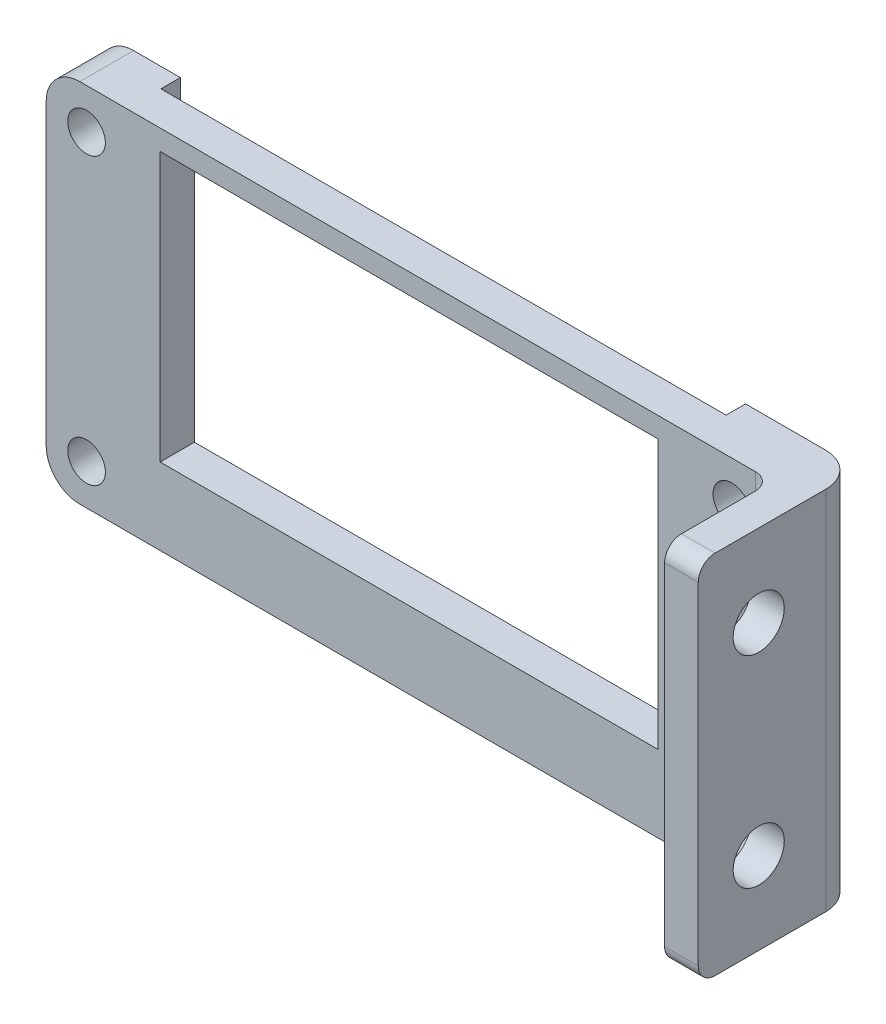
ISO-10303-21;
HEADER;
FILE_DESCRIPTION(('STEP AP214'),'2;1');
FILE_NAME('part.step','',(''),(''),'','','');
FILE_SCHEMA(('AUTOMOTIVE_DESIGN { 1 0 10303 214 1 1 1 1 }'));
ENDSEC;
DATA;
#1=APPLICATION_CONTEXT('core data for automotive mechanical design processes');
#2=APPLICATION_PROTOCOL_DEFINITION('international standard','automotive_design',2000,#1);
#3=PRODUCT_CONTEXT('',#1,'mechanical');
#4=PRODUCT('Part','Part','',(#3));
#5=PRODUCT_RELATED_PRODUCT_CATEGORY('part','',(#4));
#6=PRODUCT_DEFINITION_FORMATION('','',#4);
#7=PRODUCT_DEFINITION_CONTEXT('part definition',#1,'design');
#8=PRODUCT_DEFINITION('design','',#6,#7);
#9=PRODUCT_DEFINITION_SHAPE('','',#8);
#10=(LENGTH_UNIT() NAMED_UNIT(*) SI_UNIT(.MILLI.,.METRE.));
#11=(NAMED_UNIT(*) PLANE_ANGLE_UNIT() SI_UNIT($,.RADIAN.));
#12=(NAMED_UNIT(*) SI_UNIT($,.STERADIAN.) SOLID_ANGLE_UNIT());
#13=UNCERTAINTY_MEASURE_WITH_UNIT(LENGTH_MEASURE(1.E-05),#10,'distance_accuracy_value','');
#14=(GEOMETRIC_REPRESENTATION_CONTEXT(3) GLOBAL_UNCERTAINTY_ASSIGNED_CONTEXT((#13)) GLOBAL_UNIT_ASSIGNED_CONTEXT((#10,
#11,#12)) REPRESENTATION_CONTEXT('',''));
#15=CARTESIAN_POINT('',(0.,0.,0.));
#16=DIRECTION('',(0.,0.,1.));
#17=DIRECTION('',(1.,0.,0.));
#18=AXIS2_PLACEMENT_3D('',#15,#16,#17);
#19=CARTESIAN_POINT('',(-27.,-73.4652804702332,-1.44999999999999));
#20=DIRECTION('',(-1.,0.,0.));
#21=DIRECTION('',(0.,-1.,0.));
#22=AXIS2_PLACEMENT_3D('',#19,#20,#21);
#23=PLANE('',#22);
#24=DIRECTION('',(0.,1.,0.));
#25=VECTOR('',#24,1.);
#26=CARTESIAN_POINT('',(-27.,-73.4652804702332,2.55000000000001));
#27=LINE('',#26,#25);
#28=CARTESIAN_POINT('',(-27.,-13.205,2.55000000000001));
#29=VERTEX_POINT('',#28);
#30=CARTESIAN_POINT('',(-27.,9.01500000000001,2.55000000000001));
#31=VERTEX_POINT('',#30);
#32=EDGE_CURVE('E244',#29,#31,#27,.T.);
#33=ORIENTED_EDGE('',*,*,#32,.T.);
#34=DIRECTION('',(0.,0.,1.));
#35=VECTOR('',#34,1.);
#36=CARTESIAN_POINT('',(-27.,9.01500000000001,-1.44999999999999));
#37=LINE('',#36,#35);
#38=CARTESIAN_POINT('',(-27.,9.01500000000001,-1.44999999999999));
#39=VERTEX_POINT('',#38);
#40=EDGE_CURVE('E292',#31,#39,#37,.F.);
#41=ORIENTED_EDGE('',*,*,#40,.T.);
#42=DIRECTION('',(0.,1.,0.));
#43=VECTOR('',#42,1.);
#44=CARTESIAN_POINT('',(-27.,-73.4652804702332,-1.44999999999999));
#45=LINE('',#44,#43);
#46=CARTESIAN_POINT('',(-27.,-13.205,-1.44999999999999));
#47=VERTEX_POINT('',#46);
#48=EDGE_CURVE('E208',#47,#39,#45,.T.);
#49=ORIENTED_EDGE('',*,*,#48,.F.);
#50=DIRECTION('',(0.,0.,-1.));
#51=VECTOR('',#50,1.);
#52=CARTESIAN_POINT('',(-27.,-13.205,2.55000000000001));
#53=LINE('',#52,#51);
#54=EDGE_CURVE('E290',#47,#29,#53,.F.);
#55=ORIENTED_EDGE('',*,*,#54,.T.);
#56=EDGE_LOOP('',(#33,#41,#49,#55));
#57=FACE_BOUND('',#56,.T.);
#58=ADVANCED_FACE('F33',(#57),#23,.T.);
#59=CARTESIAN_POINT('',(-27.,-73.4652804702332,-1.44999999999999));
#60=DIRECTION('',(0.,0.,-1.));
#61=DIRECTION('',(-1.,0.,0.));
#62=AXIS2_PLACEMENT_3D('',#59,#60,#61);
#63=PLANE('',#62);
#64=CARTESIAN_POINT('',(-24.,-12.705,-1.44999999999999));
#65=DIRECTION('',(0.,0.,1.));
#66=DIRECTION('',(1.,0.,0.));
#67=AXIS2_PLACEMENT_3D('',#64,#65,#66);
#68=CIRCLE('',#67,1.4);
#69=CARTESIAN_POINT('',(-22.6,-12.705,-1.44999999999999));
#70=VERTEX_POINT('',#69);
#71=EDGE_CURVE('E646',#70,#70,#68,.T.);
#72=ORIENTED_EDGE('',*,*,#71,.T.);
#73=EDGE_LOOP('',(#72));
#74=FACE_BOUND('',#73,.T.);
#75=CARTESIAN_POINT('',(-24.,8.515,-1.44999999999999));
#76=DIRECTION('',(0.,0.,1.));
#77=DIRECTION('',(1.,0.,0.));
#78=AXIS2_PLACEMENT_3D('',#75,#76,#77);
#79=CIRCLE('',#78,1.4);
#80=CARTESIAN_POINT('',(-22.6,8.515,-1.44999999999999));
#81=VERTEX_POINT('',#80);
#82=EDGE_CURVE('E632',#81,#81,#79,.T.);
#83=ORIENTED_EDGE('',*,*,#82,.T.);
#84=EDGE_LOOP('',(#83));
#85=FACE_BOUND('',#84,.T.);
#86=ORIENTED_EDGE('',*,*,#48,.T.);
#87=CARTESIAN_POINT('',(-24.5,9.015,-1.44999999999999));
#88=DIRECTION('',(0.,0.,-1.));
#89=DIRECTION('',(-1.,0.,0.));
#90=AXIS2_PLACEMENT_3D('',#87,#88,#89);
#91=CIRCLE('',#90,2.5);
#92=CARTESIAN_POINT('',(-24.5,11.515,-1.44999999999999));
#93=VERTEX_POINT('',#92);
#94=EDGE_CURVE('E296',#39,#93,#91,.T.);
#95=ORIENTED_EDGE('',*,*,#94,.T.);
#96=DIRECTION('',(-1.,0.,0.));
#97=VECTOR('',#96,1.);
#98=CARTESIAN_POINT('',(-27.,11.515,-1.44999999999999));
#99=LINE('',#98,#97);
#100=CARTESIAN_POINT('',(-21.02,11.515,-1.44999999999999));
#101=VERTEX_POINT('',#100);
#102=EDGE_CURVE('E241',#101,#93,#99,.T.);
#103=ORIENTED_EDGE('',*,*,#102,.F.);
#104=DIRECTION('',(0.,1.,0.));
#105=VECTOR('',#104,1.);
#106=CARTESIAN_POINT('',(-21.02,-73.4652804702332,-1.44999999999999));
#107=LINE('',#106,#105);
#108=CARTESIAN_POINT('',(-21.02,-15.705,-1.44999999999999));
#109=VERTEX_POINT('',#108);
#110=EDGE_CURVE('E247',#109,#101,#107,.T.);
#111=ORIENTED_EDGE('',*,*,#110,.F.);
#112=DIRECTION('',(1.,0.,0.));
#113=VECTOR('',#112,1.);
#114=CARTESIAN_POINT('',(-27.,-15.705,-1.44999999999999));
#115=LINE('',#114,#113);
#116=CARTESIAN_POINT('',(-24.5,-15.705,-1.44999999999999));
#117=VERTEX_POINT('',#116);
#118=EDGE_CURVE('E220',#117,#109,#115,.T.);
#119=ORIENTED_EDGE('',*,*,#118,.F.);
#120=CARTESIAN_POINT('',(-24.5,-13.205,-1.44999999999999));
#121=DIRECTION('',(0.,0.,-1.));
#122=DIRECTION('',(-1.,0.,0.));
#123=AXIS2_PLACEMENT_3D('',#120,#121,#122);
#124=CIRCLE('',#123,2.5);
#125=EDGE_CURVE('E294',#117,#47,#124,.T.);
#126=ORIENTED_EDGE('',*,*,#125,.T.);
#127=EDGE_LOOP('',(#86,#95,#103,#111,#119,#126));
#128=FACE_BOUND('',#127,.T.);
#129=ADVANCED_FACE('F370',(#74,#85,#128),#63,.T.);
#130=CARTESIAN_POINT('',(-21.02,-73.4652804702332,-1.44999999999999));
#131=DIRECTION('',(1.,0.,0.));
#132=DIRECTION('',(0.,1.,0.));
#133=AXIS2_PLACEMENT_3D('',#130,#131,#132);
#134=PLANE('',#133);
#135=DIRECTION('',(0.,0.,1.));
#136=VECTOR('',#135,1.);
#137=CARTESIAN_POINT('',(-21.02,-15.705,-1.44999999999999));
#138=LINE('',#137,#136);
#139=CARTESIAN_POINT('',(-21.02,-15.705,0.));
#140=VERTEX_POINT('',#139);
#141=EDGE_CURVE('E218',#109,#140,#138,.T.);
#142=ORIENTED_EDGE('',*,*,#141,.F.);
#143=ORIENTED_EDGE('',*,*,#110,.T.);
#144=DIRECTION('',(0.,0.,-1.));
#145=VECTOR('',#144,1.);
#146=CARTESIAN_POINT('',(-21.02,11.515,-1.44999999999999));
#147=LINE('',#146,#145);
#148=CARTESIAN_POINT('',(-21.02,11.515,0.));
#149=VERTEX_POINT('',#148);
#150=EDGE_CURVE('E238',#149,#101,#147,.T.);
#151=ORIENTED_EDGE('',*,*,#150,.F.);
#152=DIRECTION('',(0.,1.,0.));
#153=VECTOR('',#152,1.);
#154=CARTESIAN_POINT('',(-21.02,-73.4652804702332,0.));
#155=LINE('',#154,#153);
#156=EDGE_CURVE('E249',#140,#149,#155,.T.);
#157=ORIENTED_EDGE('',*,*,#156,.F.);
#158=EDGE_LOOP('',(#142,#143,#151,#157));
#159=FACE_BOUND('',#158,.T.);
#160=ADVANCED_FACE('F366',(#159),#134,.T.);
#161=CARTESIAN_POINT('',(-21.02,-73.4652804702332,0.));
#162=DIRECTION('',(0.,0.,-1.));
#163=DIRECTION('',(-1.,0.,0.));
#164=AXIS2_PLACEMENT_3D('',#161,#162,#163);
#165=PLANE('',#164);
#166=DIRECTION('',(0.,1.,0.));
#167=VECTOR('',#166,1.);
#168=CARTESIAN_POINT('',(-18.525,-73.4652804702332,0.));
#169=LINE('',#168,#167);
#170=CARTESIAN_POINT('',(-18.525,-10.,0.));
#171=VERTEX_POINT('',#170);
#172=CARTESIAN_POINT('',(-18.525,9.99999999999999,0.));
#173=VERTEX_POINT('',#172);
#174=EDGE_CURVE('E199',#171,#173,#169,.T.);
#175=ORIENTED_EDGE('',*,*,#174,.F.);
#176=DIRECTION('',(-1.,0.,0.));
#177=VECTOR('',#176,1.);
#178=CARTESIAN_POINT('',(-21.02,-9.99999999999999,0.));
#179=LINE('',#178,#177);
#180=CARTESIAN_POINT('',(18.525,-10.,0.));
#181=VERTEX_POINT('',#180);
#182=EDGE_CURVE('E197',#181,#171,#179,.T.);
#183=ORIENTED_EDGE('',*,*,#182,.F.);
#184=DIRECTION('',(0.,1.,0.));
#185=VECTOR('',#184,1.);
#186=CARTESIAN_POINT('',(18.525,-73.4652804702332,0.));
#187=LINE('',#186,#185);
#188=CARTESIAN_POINT('',(18.525,10.,0.));
#189=VERTEX_POINT('',#188);
#190=EDGE_CURVE('E182',#181,#189,#187,.T.);
#191=ORIENTED_EDGE('',*,*,#190,.T.);
#192=DIRECTION('',(-1.,0.,0.));
#193=VECTOR('',#192,1.);
#194=CARTESIAN_POINT('',(-21.02,9.99999999999999,0.));
#195=LINE('',#194,#193);
#196=EDGE_CURVE('E171',#189,#173,#195,.T.);
#197=ORIENTED_EDGE('',*,*,#196,.T.);
#198=EDGE_LOOP('',(#175,#183,#191,#197));
#199=FACE_BOUND('',#198,.T.);
#200=DIRECTION('',(1.,0.,0.));
#201=VECTOR('',#200,1.);
#202=CARTESIAN_POINT('',(-21.02,-15.705,0.));
#203=LINE('',#202,#201);
#204=CARTESIAN_POINT('',(21.02,-15.705,0.));
#205=VERTEX_POINT('',#204);
#206=EDGE_CURVE('E216',#140,#205,#203,.T.);
#207=ORIENTED_EDGE('',*,*,#206,.F.);
#208=ORIENTED_EDGE('',*,*,#156,.T.);
#209=DIRECTION('',(-1.,0.,0.));
#210=VECTOR('',#209,1.);
#211=CARTESIAN_POINT('',(-21.02,11.515,0.));
#212=LINE('',#211,#210);
#213=CARTESIAN_POINT('',(21.02,11.515,0.));
#214=VERTEX_POINT('',#213);
#215=EDGE_CURVE('E235',#214,#149,#212,.T.);
#216=ORIENTED_EDGE('',*,*,#215,.F.);
#217=DIRECTION('',(0.,1.,0.));
#218=VECTOR('',#217,1.);
#219=CARTESIAN_POINT('',(21.02,-73.4652804702332,0.));
#220=LINE('',#219,#218);
#221=EDGE_CURVE('E251',#205,#214,#220,.T.);
#222=ORIENTED_EDGE('',*,*,#221,.F.);
#223=EDGE_LOOP('',(#207,#208,#216,#222));
#224=FACE_BOUND('',#223,.T.);
#225=ADVANCED_FACE('F195',(#199,#224),#165,.T.);
#226=CARTESIAN_POINT('',(21.02,-73.4652804702332,0.));
#227=DIRECTION('',(-1.,0.,0.));
#228=DIRECTION('',(0.,-1.,0.));
#229=AXIS2_PLACEMENT_3D('',#226,#227,#228);
#230=PLANE('',#229);
#231=DIRECTION('',(0.,0.,-1.));
#232=VECTOR('',#231,1.);
#233=CARTESIAN_POINT('',(21.02,-15.705,0.));
#234=LINE('',#233,#232);
#235=CARTESIAN_POINT('',(21.02,-15.705,-1.44999999999999));
#236=VERTEX_POINT('',#235);
#237=EDGE_CURVE('E214',#205,#236,#234,.T.);
#238=ORIENTED_EDGE('',*,*,#237,.F.);
#239=ORIENTED_EDGE('',*,*,#221,.T.);
#240=DIRECTION('',(0.,0.,1.));
#241=VECTOR('',#240,1.);
#242=CARTESIAN_POINT('',(21.02,11.515,0.));
#243=LINE('',#242,#241);
#244=CARTESIAN_POINT('',(21.02,11.515,-1.44999999999999));
#245=VERTEX_POINT('',#244);
#246=EDGE_CURVE('E232',#245,#214,#243,.T.);
#247=ORIENTED_EDGE('',*,*,#246,.F.);
#248=DIRECTION('',(0.,1.,0.));
#249=VECTOR('',#248,1.);
#250=CARTESIAN_POINT('',(21.02,-73.4652804702332,-1.44999999999999));
#251=LINE('',#250,#249);
#252=EDGE_CURVE('E253',#236,#245,#251,.T.);
#253=ORIENTED_EDGE('',*,*,#252,.F.);
#254=EDGE_LOOP('',(#238,#239,#247,#253));
#255=FACE_BOUND('',#254,.T.);
#256=ADVANCED_FACE('F357',(#255),#230,.T.);
#257=CARTESIAN_POINT('',(21.02,-73.4652804702332,-1.44999999999999));
#258=DIRECTION('',(0.,0.,-1.));
#259=DIRECTION('',(-1.,0.,0.));
#260=AXIS2_PLACEMENT_3D('',#257,#258,#259);
#261=PLANE('',#260);
#262=CARTESIAN_POINT('',(24.,-12.705,-1.44999999999999));
#263=DIRECTION('',(0.,0.,1.));
#264=DIRECTION('',(1.,0.,0.));
#265=AXIS2_PLACEMENT_3D('',#262,#263,#264);
#266=CIRCLE('',#265,1.4);
#267=CARTESIAN_POINT('',(25.4,-12.705,-1.44999999999999));
#268=VERTEX_POINT('',#267);
#269=EDGE_CURVE('E624',#268,#268,#266,.T.);
#270=ORIENTED_EDGE('',*,*,#269,.T.);
#271=EDGE_LOOP('',(#270));
#272=FACE_BOUND('',#271,.T.);
#273=CARTESIAN_POINT('',(24.,8.515,-1.44999999999999));
#274=DIRECTION('',(0.,0.,1.));
#275=DIRECTION('',(1.,0.,0.));
#276=AXIS2_PLACEMENT_3D('',#273,#274,#275);
#277=CIRCLE('',#276,1.4);
#278=CARTESIAN_POINT('',(25.4,8.515,-1.44999999999999));
#279=VERTEX_POINT('',#278);
#280=EDGE_CURVE('E627',#279,#279,#277,.T.);
#281=ORIENTED_EDGE('',*,*,#280,.T.);
#282=EDGE_LOOP('',(#281));
#283=FACE_BOUND('',#282,.T.);
#284=DIRECTION('',(-1.,0.,0.));
#285=VECTOR('',#284,1.);
#286=CARTESIAN_POINT('',(21.02,11.515,-1.44999999999999));
#287=LINE('',#286,#285);
#288=CARTESIAN_POINT('',(27.,11.515,-1.44999999999999));
#289=VERTEX_POINT('',#288);
#290=EDGE_CURVE('E230',#289,#245,#287,.T.);
#291=ORIENTED_EDGE('',*,*,#290,.F.);
#292=DIRECTION('',(0.,1.,0.));
#293=VECTOR('',#292,1.);
#294=CARTESIAN_POINT('',(27.,-73.4652804702332,-1.44999999999999));
#295=LINE('',#294,#293);
#296=CARTESIAN_POINT('',(27.,-15.705,-1.44999999999999));
#297=VERTEX_POINT('',#296);
#298=EDGE_CURVE('E278',#289,#297,#295,.F.);
#299=ORIENTED_EDGE('',*,*,#298,.T.);
#300=DIRECTION('',(1.,0.,0.));
#301=VECTOR('',#300,1.);
#302=CARTESIAN_POINT('',(21.02,-15.705,-1.44999999999999));
#303=LINE('',#302,#301);
#304=EDGE_CURVE('E211',#236,#297,#303,.T.);
#305=ORIENTED_EDGE('',*,*,#304,.F.);
#306=ORIENTED_EDGE('',*,*,#252,.T.);
#307=EDGE_LOOP('',(#291,#299,#305,#306));
#308=FACE_BOUND('',#307,.T.);
#309=ADVANCED_FACE('F352',(#272,#283,#308),#261,.T.);
#310=CARTESIAN_POINT('',(29.5,-73.4652804702332,10.55));
#311=DIRECTION('',(1.,0.,0.));
#312=DIRECTION('',(0.,1.,0.));
#313=AXIS2_PLACEMENT_3D('',#310,#311,#312);
#314=PLANE('',#313);
#315=CARTESIAN_POINT('',(29.5,-9.59500000000001,6.05000000000001));
#316=DIRECTION('',(1.,0.,0.));
#317=DIRECTION('',(0.,0.,-1.));
#318=AXIS2_PLACEMENT_3D('',#315,#316,#317);
#319=CIRCLE('',#318,1.89999999999999);
#320=CARTESIAN_POINT('',(29.5,-9.59500000000001,4.15000000000001));
#321=VERTEX_POINT('',#320);
#322=EDGE_CURVE('E313',#321,#321,#319,.T.);
#323=ORIENTED_EDGE('',*,*,#322,.F.);
#324=EDGE_LOOP('',(#323));
#325=FACE_BOUND('',#324,.T.);
#326=CARTESIAN_POINT('',(29.5,5.40499999999999,6.05000000000001));
#327=DIRECTION('',(1.,0.,0.));
#328=DIRECTION('',(0.,0.,-1.));
#329=AXIS2_PLACEMENT_3D('',#326,#327,#328);
#330=CIRCLE('',#329,1.89999999999999);
#331=CARTESIAN_POINT('',(29.5,5.40499999999999,4.15000000000001));
#332=VERTEX_POINT('',#331);
#333=EDGE_CURVE('E312',#332,#332,#330,.T.);
#334=ORIENTED_EDGE('',*,*,#333,.F.);
#335=EDGE_LOOP('',(#334));
#336=FACE_BOUND('',#335,.T.);
#337=DIRECTION('',(0.,0.,-1.));
#338=VECTOR('',#337,1.);
#339=CARTESIAN_POINT('',(29.5,11.515,10.55));
#340=LINE('',#339,#338);
#341=CARTESIAN_POINT('',(29.5,11.515,9.30000000000001));
#342=VERTEX_POINT('',#341);
#343=CARTESIAN_POINT('',(29.5,11.515,1.05000000000001));
#344=VERTEX_POINT('',#343);
#345=EDGE_CURVE('E228',#342,#344,#340,.T.);
#346=ORIENTED_EDGE('',*,*,#345,.F.);
#347=CARTESIAN_POINT('',(29.5,10.265,9.30000000000001));
#348=DIRECTION('',(1.,0.,0.));
#349=DIRECTION('',(0.,1.,0.));
#350=AXIS2_PLACEMENT_3D('',#347,#348,#349);
#351=CIRCLE('',#350,1.25);
#352=CARTESIAN_POINT('',(29.5,10.265,10.55));
#353=VERTEX_POINT('',#352);
#354=EDGE_CURVE('E318',#342,#353,#351,.T.);
#355=ORIENTED_EDGE('',*,*,#354,.T.);
#356=DIRECTION('',(0.,1.,0.));
#357=VECTOR('',#356,1.);
#358=CARTESIAN_POINT('',(29.5,-73.4652804702332,10.55));
#359=LINE('',#358,#357);
#360=CARTESIAN_POINT('',(29.5,-14.455,10.55));
#361=VERTEX_POINT('',#360);
#362=EDGE_CURVE('E256',#361,#353,#359,.T.);
#363=ORIENTED_EDGE('',*,*,#362,.F.);
#364=CARTESIAN_POINT('',(29.5,-14.455,9.30000000000001));
#365=DIRECTION('',(1.,0.,0.));
#366=DIRECTION('',(0.,1.,0.));
#367=AXIS2_PLACEMENT_3D('',#364,#365,#366);
#368=CIRCLE('',#367,1.25);
#369=CARTESIAN_POINT('',(29.5,-15.705,9.30000000000001));
#370=VERTEX_POINT('',#369);
#371=EDGE_CURVE('E316',#361,#370,#368,.T.);
#372=ORIENTED_EDGE('',*,*,#371,.T.);
#373=DIRECTION('',(0.,0.,1.));
#374=VECTOR('',#373,1.);
#375=CARTESIAN_POINT('',(29.5,-15.705,10.55));
#376=LINE('',#375,#374);
#377=CARTESIAN_POINT('',(29.5,-15.705,1.05000000000001));
#378=VERTEX_POINT('',#377);
#379=EDGE_CURVE('E207',#378,#370,#376,.T.);
#380=ORIENTED_EDGE('',*,*,#379,.F.);
#381=DIRECTION('',(0.,1.,0.));
#382=VECTOR('',#381,1.);
#383=CARTESIAN_POINT('',(29.5,-73.4652804702332,1.05000000000001));
#384=LINE('',#383,#382);
#385=EDGE_CURVE('E270',#378,#344,#384,.T.);
#386=ORIENTED_EDGE('',*,*,#385,.T.);
#387=EDGE_LOOP('',(#346,#355,#363,#372,#380,#386));
#388=FACE_BOUND('',#387,.T.);
#389=ADVANCED_FACE('F336',(#325,#336,#388),#314,.T.);
#390=CARTESIAN_POINT('',(27.,-73.4652804702332,10.55));
#391=DIRECTION('',(0.,0.,1.));
#392=DIRECTION('',(1.,0.,0.));
#393=AXIS2_PLACEMENT_3D('',#390,#391,#392);
#394=PLANE('',#393);
#395=ORIENTED_EDGE('',*,*,#362,.T.);
#396=DIRECTION('',(1.,0.,0.));
#397=VECTOR('',#396,1.);
#398=CARTESIAN_POINT('',(27.,10.265,10.55));
#399=LINE('',#398,#397);
#400=CARTESIAN_POINT('',(27.,10.265,10.55));
#401=VERTEX_POINT('',#400);
#402=EDGE_CURVE('E55',#353,#401,#399,.F.);
#403=ORIENTED_EDGE('',*,*,#402,.T.);
#404=DIRECTION('',(0.,1.,0.));
#405=VECTOR('',#404,1.);
#406=CARTESIAN_POINT('',(27.,-73.4652804702332,10.55));
#407=LINE('',#406,#405);
#408=CARTESIAN_POINT('',(27.,-14.455,10.55));
#409=VERTEX_POINT('',#408);
#410=EDGE_CURVE('E258',#409,#401,#407,.T.);
#411=ORIENTED_EDGE('',*,*,#410,.F.);
#412=DIRECTION('',(-1.,0.,0.));
#413=VECTOR('',#412,1.);
#414=CARTESIAN_POINT('',(29.5,-14.455,10.55));
#415=LINE('',#414,#413);
#416=EDGE_CURVE('E320',#409,#361,#415,.F.);
#417=ORIENTED_EDGE('',*,*,#416,.T.);
#418=EDGE_LOOP('',(#395,#403,#411,#417));
#419=FACE_BOUND('',#418,.T.);
#420=ADVANCED_FACE('F338',(#419),#394,.T.);
#421=CARTESIAN_POINT('',(27.,-73.4652804702332,2.55000000000001));
#422=DIRECTION('',(-1.,0.,0.));
#423=DIRECTION('',(0.,0.,1.));
#424=AXIS2_PLACEMENT_3D('',#421,#422,#423);
#425=PLANE('',#424);
#426=CARTESIAN_POINT('',(27.,-9.59500000000001,6.05000000000001));
#427=DIRECTION('',(-1.,0.,0.));
#428=DIRECTION('',(0.,0.,1.));
#429=AXIS2_PLACEMENT_3D('',#426,#427,#428);
#430=CIRCLE('',#429,1.89999999999999);
#431=CARTESIAN_POINT('',(27.,-9.59500000000001,7.94999999999999));
#432=VERTEX_POINT('',#431);
#433=EDGE_CURVE('E309',#432,#432,#430,.T.);
#434=ORIENTED_EDGE('',*,*,#433,.F.);
#435=EDGE_LOOP('',(#434));
#436=FACE_BOUND('',#435,.T.);
#437=CARTESIAN_POINT('',(27.,5.40499999999999,6.05000000000001));
#438=DIRECTION('',(-1.,0.,0.));
#439=DIRECTION('',(0.,0.,1.));
#440=AXIS2_PLACEMENT_3D('',#437,#438,#439);
#441=CIRCLE('',#440,1.89999999999999);
#442=CARTESIAN_POINT('',(27.,5.40499999999999,7.95));
#443=VERTEX_POINT('',#442);
#444=EDGE_CURVE('E656',#443,#443,#441,.T.);
#445=ORIENTED_EDGE('',*,*,#444,.F.);
#446=EDGE_LOOP('',(#445));
#447=FACE_BOUND('',#446,.T.);
#448=ORIENTED_EDGE('',*,*,#410,.T.);
#449=CARTESIAN_POINT('',(27.,10.265,9.30000000000001));
#450=DIRECTION('',(-1.,0.,0.));
#451=DIRECTION('',(0.,0.,1.));
#452=AXIS2_PLACEMENT_3D('',#449,#450,#451);
#453=CIRCLE('',#452,1.25);
#454=CARTESIAN_POINT('',(27.,11.515,9.30000000000001));
#455=VERTEX_POINT('',#454);
#456=EDGE_CURVE('E41',#401,#455,#453,.T.);
#457=ORIENTED_EDGE('',*,*,#456,.T.);
#458=DIRECTION('',(0.,0.,1.));
#459=VECTOR('',#458,1.);
#460=CARTESIAN_POINT('',(27.,11.515,2.55000000000001));
#461=LINE('',#460,#459);
#462=CARTESIAN_POINT('',(27.,11.515,3.80000000000001));
#463=VERTEX_POINT('',#462);
#464=EDGE_CURVE('E225',#463,#455,#461,.T.);
#465=ORIENTED_EDGE('',*,*,#464,.F.);
#466=DIRECTION('',(0.,1.,0.));
#467=VECTOR('',#466,1.);
#468=CARTESIAN_POINT('',(27.,-15.705,3.80000000000001));
#469=LINE('',#468,#467);
#470=CARTESIAN_POINT('',(27.,-15.705,3.80000000000001));
#471=VERTEX_POINT('',#470);
#472=EDGE_CURVE('E301',#463,#471,#469,.F.);
#473=ORIENTED_EDGE('',*,*,#472,.T.);
#474=DIRECTION('',(0.,0.,-1.));
#475=VECTOR('',#474,1.);
#476=CARTESIAN_POINT('',(27.,-15.705,2.55000000000001));
#477=LINE('',#476,#475);
#478=CARTESIAN_POINT('',(27.,-15.705,9.30000000000001));
#479=VERTEX_POINT('',#478);
#480=EDGE_CURVE('E205',#479,#471,#477,.T.);
#481=ORIENTED_EDGE('',*,*,#480,.F.);
#482=CARTESIAN_POINT('',(27.,-14.455,9.30000000000001));
#483=DIRECTION('',(-1.,0.,0.));
#484=DIRECTION('',(0.,0.,1.));
#485=AXIS2_PLACEMENT_3D('',#482,#483,#484);
#486=CIRCLE('',#485,1.25);
#487=EDGE_CURVE('E48',#479,#409,#486,.T.);
#488=ORIENTED_EDGE('',*,*,#487,.T.);
#489=EDGE_LOOP('',(#448,#457,#465,#473,#481,#488));
#490=FACE_BOUND('',#489,.T.);
#491=ADVANCED_FACE('F326',(#436,#447,#490),#425,.T.);
#492=CARTESIAN_POINT('',(-27.,-73.4652804702332,2.55000000000001));
#493=DIRECTION('',(0.,0.,1.));
#494=DIRECTION('',(1.,0.,0.));
#495=AXIS2_PLACEMENT_3D('',#492,#493,#494);
#496=PLANE('',#495);
#497=CARTESIAN_POINT('',(24.,-12.705,2.55000000000001));
#498=DIRECTION('',(0.,0.,1.));
#499=DIRECTION('',(1.,0.,0.));
#500=AXIS2_PLACEMENT_3D('',#497,#498,#499);
#501=CIRCLE('',#500,1.4);
#502=CARTESIAN_POINT('',(25.4,-12.705,2.55000000000001));
#503=VERTEX_POINT('',#502);
#504=EDGE_CURVE('E653',#503,#503,#501,.T.);
#505=ORIENTED_EDGE('',*,*,#504,.F.);
#506=EDGE_LOOP('',(#505));
#507=FACE_BOUND('',#506,.T.);
#508=CARTESIAN_POINT('',(-24.,-12.705,2.55000000000001));
#509=DIRECTION('',(0.,0.,1.));
#510=DIRECTION('',(1.,0.,0.));
#511=AXIS2_PLACEMENT_3D('',#508,#509,#510);
#512=CIRCLE('',#511,1.4);
#513=CARTESIAN_POINT('',(-22.6,-12.705,2.55000000000001));
#514=VERTEX_POINT('',#513);
#515=EDGE_CURVE('E649',#514,#514,#512,.T.);
#516=ORIENTED_EDGE('',*,*,#515,.F.);
#517=EDGE_LOOP('',(#516));
#518=FACE_BOUND('',#517,.T.);
#519=CARTESIAN_POINT('',(-24.,8.515,2.55000000000001));
#520=DIRECTION('',(0.,0.,1.));
#521=DIRECTION('',(1.,0.,0.));
#522=AXIS2_PLACEMENT_3D('',#519,#520,#521);
#523=CIRCLE('',#522,1.4);
#524=CARTESIAN_POINT('',(-22.6,8.515,2.55000000000001));
#525=VERTEX_POINT('',#524);
#526=EDGE_CURVE('E643',#525,#525,#523,.T.);
#527=ORIENTED_EDGE('',*,*,#526,.F.);
#528=EDGE_LOOP('',(#527));
#529=FACE_BOUND('',#528,.T.);
#530=CARTESIAN_POINT('',(24.,8.515,2.55000000000001));
#531=DIRECTION('',(0.,0.,1.));
#532=DIRECTION('',(1.,0.,0.));
#533=AXIS2_PLACEMENT_3D('',#530,#531,#532);
#534=CIRCLE('',#533,1.4);
#535=CARTESIAN_POINT('',(25.4,8.515,2.55000000000001));
#536=VERTEX_POINT('',#535);
#537=EDGE_CURVE('E628',#536,#536,#534,.T.);
#538=ORIENTED_EDGE('',*,*,#537,.F.);
#539=EDGE_LOOP('',(#538));
#540=FACE_BOUND('',#539,.T.);
#541=DIRECTION('',(0.,-1.,0.));
#542=VECTOR('',#541,1.);
#543=CARTESIAN_POINT('',(-18.525,-73.4652804702332,2.55000000000001));
#544=LINE('',#543,#542);
#545=CARTESIAN_POINT('',(-18.525,10.,2.55000000000001));
#546=VERTEX_POINT('',#545);
#547=CARTESIAN_POINT('',(-18.525,-10.,2.55000000000001));
#548=VERTEX_POINT('',#547);
#549=EDGE_CURVE('E268',#546,#548,#544,.T.);
#550=ORIENTED_EDGE('',*,*,#549,.F.);
#551=DIRECTION('',(1.,0.,0.));
#552=VECTOR('',#551,1.);
#553=CARTESIAN_POINT('',(-27.,9.99999999999999,2.55000000000001));
#554=LINE('',#553,#552);
#555=CARTESIAN_POINT('',(18.525,9.99999999999999,2.55000000000001));
#556=VERTEX_POINT('',#555);
#557=EDGE_CURVE('E263',#546,#556,#554,.T.);
#558=ORIENTED_EDGE('',*,*,#557,.T.);
#559=DIRECTION('',(0.,-1.,0.));
#560=VECTOR('',#559,1.);
#561=CARTESIAN_POINT('',(18.525,-73.4652804702332,2.55000000000001));
#562=LINE('',#561,#560);
#563=CARTESIAN_POINT('',(18.525,-10.,2.55000000000001));
#564=VERTEX_POINT('',#563);
#565=EDGE_CURVE('E190',#556,#564,#562,.T.);
#566=ORIENTED_EDGE('',*,*,#565,.T.);
#567=DIRECTION('',(1.,0.,0.));
#568=VECTOR('',#567,1.);
#569=CARTESIAN_POINT('',(-27.,-9.99999999999999,2.55000000000001));
#570=LINE('',#569,#568);
#571=EDGE_CURVE('E266',#548,#564,#570,.T.);
#572=ORIENTED_EDGE('',*,*,#571,.F.);
#573=EDGE_LOOP('',(#550,#558,#566,#572));
#574=FACE_BOUND('',#573,.T.);
#575=DIRECTION('',(-1.,0.,0.));
#576=VECTOR('',#575,1.);
#577=CARTESIAN_POINT('',(-27.,-15.705,2.55000000000001));
#578=LINE('',#577,#576);
#579=CARTESIAN_POINT('',(25.75,-15.705,2.55000000000001));
#580=VERTEX_POINT('',#579);
#581=CARTESIAN_POINT('',(-24.5,-15.705,2.55000000000001));
#582=VERTEX_POINT('',#581);
#583=EDGE_CURVE('E222',#580,#582,#578,.T.);
#584=ORIENTED_EDGE('',*,*,#583,.F.);
#585=DIRECTION('',(0.,1.,0.));
#586=VECTOR('',#585,1.);
#587=CARTESIAN_POINT('',(25.75,11.515,2.55000000000001));
#588=LINE('',#587,#586);
#589=CARTESIAN_POINT('',(25.75,11.515,2.55000000000001));
#590=VERTEX_POINT('',#589);
#591=EDGE_CURVE('E298',#580,#590,#588,.T.);
#592=ORIENTED_EDGE('',*,*,#591,.T.);
#593=DIRECTION('',(1.,0.,0.));
#594=VECTOR('',#593,1.);
#595=CARTESIAN_POINT('',(-27.,11.515,2.55000000000001));
#596=LINE('',#595,#594);
#597=CARTESIAN_POINT('',(-24.5,11.515,2.55000000000001));
#598=VERTEX_POINT('',#597);
#599=EDGE_CURVE('E204',#598,#590,#596,.T.);
#600=ORIENTED_EDGE('',*,*,#599,.F.);
#601=CARTESIAN_POINT('',(-24.5,9.015,2.55000000000001));
#602=DIRECTION('',(0.,0.,1.));
#603=DIRECTION('',(1.,0.,0.));
#604=AXIS2_PLACEMENT_3D('',#601,#602,#603);
#605=CIRCLE('',#604,2.5);
#606=EDGE_CURVE('E288',#598,#31,#605,.T.);
#607=ORIENTED_EDGE('',*,*,#606,.T.);
#608=ORIENTED_EDGE('',*,*,#32,.F.);
#609=CARTESIAN_POINT('',(-24.5,-13.205,2.55000000000001));
#610=DIRECTION('',(0.,0.,1.));
#611=DIRECTION('',(1.,0.,0.));
#612=AXIS2_PLACEMENT_3D('',#609,#610,#611);
#613=CIRCLE('',#612,2.5);
#614=EDGE_CURVE('E285',#29,#582,#613,.T.);
#615=ORIENTED_EDGE('',*,*,#614,.T.);
#616=EDGE_LOOP('',(#584,#592,#600,#607,#608,#615));
#617=FACE_BOUND('',#616,.T.);
#618=ADVANCED_FACE('F380',(#507,#518,#529,#540,#574,#617),#496,.T.);
#619=CARTESIAN_POINT('',(0.,11.515,0.));
#620=DIRECTION('',(0.,1.,0.));
#621=DIRECTION('',(-1.,0.,0.));
#622=AXIS2_PLACEMENT_3D('',#619,#620,#621);
#623=PLANE('',#622);
#624=ORIENTED_EDGE('',*,*,#464,.T.);
#625=DIRECTION('',(1.,0.,0.));
#626=VECTOR('',#625,1.);
#627=CARTESIAN_POINT('',(0.,11.515,9.30000000000001));
#628=LINE('',#627,#626);
#629=EDGE_CURVE('E308',#455,#342,#628,.T.);
#630=ORIENTED_EDGE('',*,*,#629,.T.);
#631=ORIENTED_EDGE('',*,*,#345,.T.);
#632=CARTESIAN_POINT('',(27.,11.515,1.05000000000001));
#633=DIRECTION('',(0.,1.,0.));
#634=DIRECTION('',(-1.,0.,0.));
#635=AXIS2_PLACEMENT_3D('',#632,#633,#634);
#636=CIRCLE('',#635,2.5);
#637=EDGE_CURVE('E276',#344,#289,#636,.T.);
#638=ORIENTED_EDGE('',*,*,#637,.T.);
#639=ORIENTED_EDGE('',*,*,#290,.T.);
#640=ORIENTED_EDGE('',*,*,#246,.T.);
#641=ORIENTED_EDGE('',*,*,#215,.T.);
#642=ORIENTED_EDGE('',*,*,#150,.T.);
#643=ORIENTED_EDGE('',*,*,#102,.T.);
#644=DIRECTION('',(0.,0.,1.));
#645=VECTOR('',#644,1.);
#646=CARTESIAN_POINT('',(-24.5,11.515,0.));
#647=LINE('',#646,#645);
#648=EDGE_CURVE('E273',#93,#598,#647,.T.);
#649=ORIENTED_EDGE('',*,*,#648,.T.);
#650=ORIENTED_EDGE('',*,*,#599,.T.);
#651=CARTESIAN_POINT('',(25.75,11.515,3.80000000000001));
#652=DIRECTION('',(0.,1.,0.));
#653=DIRECTION('',(-1.,0.,0.));
#654=AXIS2_PLACEMENT_3D('',#651,#652,#653);
#655=CIRCLE('',#654,1.25);
#656=EDGE_CURVE('E304',#590,#463,#655,.F.);
#657=ORIENTED_EDGE('',*,*,#656,.T.);
#658=EDGE_LOOP('',(#624,#630,#631,#638,#639,#640,#641,#642,#643,#649,#650,#657));
#659=FACE_BOUND('',#658,.T.);
#660=ADVANCED_FACE('F331',(#659),#623,.T.);
#661=CARTESIAN_POINT('',(-27.,-15.705,-3.94999999999999));
#662=DIRECTION('',(0.,1.,0.));
#663=DIRECTION('',(1.,0.,0.));
#664=AXIS2_PLACEMENT_3D('',#661,#662,#663);
#665=PLANE('',#664);
#666=ORIENTED_EDGE('',*,*,#379,.T.);
#667=DIRECTION('',(-1.,0.,0.));
#668=VECTOR('',#667,1.);
#669=CARTESIAN_POINT('',(27.,-15.705,9.30000000000001));
#670=LINE('',#669,#668);
#671=EDGE_CURVE('E11',#370,#479,#670,.T.);
#672=ORIENTED_EDGE('',*,*,#671,.T.);
#673=ORIENTED_EDGE('',*,*,#480,.T.);
#674=CARTESIAN_POINT('',(25.75,-15.705,3.80000000000001));
#675=DIRECTION('',(0.,1.,0.));
#676=DIRECTION('',(-1.,0.,0.));
#677=AXIS2_PLACEMENT_3D('',#674,#675,#676);
#678=CIRCLE('',#677,1.25);
#679=EDGE_CURVE('E306',#471,#580,#678,.T.);
#680=ORIENTED_EDGE('',*,*,#679,.T.);
#681=ORIENTED_EDGE('',*,*,#583,.T.);
#682=DIRECTION('',(0.,0.,-1.));
#683=VECTOR('',#682,1.);
#684=CARTESIAN_POINT('',(-24.5,-15.705,-1.44999999999999));
#685=LINE('',#684,#683);
#686=EDGE_CURVE('E280',#582,#117,#685,.T.);
#687=ORIENTED_EDGE('',*,*,#686,.T.);
#688=ORIENTED_EDGE('',*,*,#118,.T.);
#689=ORIENTED_EDGE('',*,*,#141,.T.);
#690=ORIENTED_EDGE('',*,*,#206,.T.);
#691=ORIENTED_EDGE('',*,*,#237,.T.);
#692=ORIENTED_EDGE('',*,*,#304,.T.);
#693=CARTESIAN_POINT('',(27.,-15.705,1.05000000000001));
#694=DIRECTION('',(0.,1.,0.));
#695=DIRECTION('',(-1.,0.,0.));
#696=AXIS2_PLACEMENT_3D('',#693,#694,#695);
#697=CIRCLE('',#696,2.5);
#698=EDGE_CURVE('E283',#297,#378,#697,.F.);
#699=ORIENTED_EDGE('',*,*,#698,.T.);
#700=EDGE_LOOP('',(#666,#672,#673,#680,#681,#687,#688,#689,#690,#691,#692,#699));
#701=FACE_BOUND('',#700,.T.);
#702=ADVANCED_FACE('F342',(#701),#665,.F.);
#703=CARTESIAN_POINT('',(-18.525,0.,10.55));
#704=DIRECTION('',(-1.,0.,0.));
#705=DIRECTION('',(0.,0.,1.));
#706=AXIS2_PLACEMENT_3D('',#703,#704,#705);
#707=PLANE('',#706);
#708=ORIENTED_EDGE('',*,*,#174,.T.);
#709=DIRECTION('',(0.,0.,-1.));
#710=VECTOR('',#709,1.);
#711=CARTESIAN_POINT('',(-18.525,10.,10.55));
#712=LINE('',#711,#710);
#713=EDGE_CURVE('E177',#546,#173,#712,.T.);
#714=ORIENTED_EDGE('',*,*,#713,.F.);
#715=ORIENTED_EDGE('',*,*,#549,.T.);
#716=DIRECTION('',(0.,0.,-1.));
#717=VECTOR('',#716,1.);
#718=CARTESIAN_POINT('',(-18.525,-10.,10.55));
#719=LINE('',#718,#717);
#720=EDGE_CURVE('E183',#548,#171,#719,.T.);
#721=ORIENTED_EDGE('',*,*,#720,.T.);
#722=EDGE_LOOP('',(#708,#714,#715,#721));
#723=FACE_BOUND('',#722,.T.);
#724=ADVANCED_FACE('F499',(#723),#707,.F.);
#725=CARTESIAN_POINT('',(0.,-10.,10.55));
#726=DIRECTION('',(0.,-1.,0.));
#727=DIRECTION('',(0.,0.,-1.));
#728=AXIS2_PLACEMENT_3D('',#725,#726,#727);
#729=PLANE('',#728);
#730=ORIENTED_EDGE('',*,*,#182,.T.);
#731=ORIENTED_EDGE('',*,*,#720,.F.);
#732=ORIENTED_EDGE('',*,*,#571,.T.);
#733=DIRECTION('',(0.,0.,-1.));
#734=VECTOR('',#733,1.);
#735=CARTESIAN_POINT('',(18.525,-10.,10.55));
#736=LINE('',#735,#734);
#737=EDGE_CURVE('E192',#564,#181,#736,.T.);
#738=ORIENTED_EDGE('',*,*,#737,.T.);
#739=EDGE_LOOP('',(#730,#731,#732,#738));
#740=FACE_BOUND('',#739,.T.);
#741=ADVANCED_FACE('F520',(#740),#729,.F.);
#742=CARTESIAN_POINT('',(18.525,0.,10.55));
#743=DIRECTION('',(-1.,0.,0.));
#744=DIRECTION('',(0.,0.,1.));
#745=AXIS2_PLACEMENT_3D('',#742,#743,#744);
#746=PLANE('',#745);
#747=ORIENTED_EDGE('',*,*,#737,.F.);
#748=ORIENTED_EDGE('',*,*,#565,.F.);
#749=DIRECTION('',(0.,0.,-1.));
#750=VECTOR('',#749,1.);
#751=CARTESIAN_POINT('',(18.525,10.,10.55));
#752=LINE('',#751,#750);
#753=EDGE_CURVE('E174',#556,#189,#752,.T.);
#754=ORIENTED_EDGE('',*,*,#753,.T.);
#755=ORIENTED_EDGE('',*,*,#190,.F.);
#756=EDGE_LOOP('',(#747,#748,#754,#755));
#757=FACE_BOUND('',#756,.T.);
#758=ADVANCED_FACE('F187',(#757),#746,.T.);
#759=CARTESIAN_POINT('',(0.,10.,10.55));
#760=DIRECTION('',(0.,-1.,0.));
#761=DIRECTION('',(0.,0.,-1.));
#762=AXIS2_PLACEMENT_3D('',#759,#760,#761);
#763=PLANE('',#762);
#764=ORIENTED_EDGE('',*,*,#753,.F.);
#765=ORIENTED_EDGE('',*,*,#557,.F.);
#766=ORIENTED_EDGE('',*,*,#713,.T.);
#767=ORIENTED_EDGE('',*,*,#196,.F.);
#768=EDGE_LOOP('',(#764,#765,#766,#767));
#769=FACE_BOUND('',#768,.T.);
#770=ADVANCED_FACE('F173',(#769),#763,.T.);
#771=CARTESIAN_POINT('',(24.,8.515,2.55000000000001));
#772=DIRECTION('',(0.,0.,1.));
#773=DIRECTION('',(1.,0.,0.));
#774=AXIS2_PLACEMENT_3D('',#771,#772,#773);
#775=CYLINDRICAL_SURFACE('',#774,1.4);
#776=ORIENTED_EDGE('',*,*,#280,.F.);
#777=EDGE_LOOP('',(#776));
#778=FACE_BOUND('',#777,.T.);
#779=ORIENTED_EDGE('',*,*,#537,.T.);
#780=EDGE_LOOP('',(#779));
#781=FACE_BOUND('',#780,.T.);
#782=ADVANCED_FACE('F541',(#778,#781),#775,.F.);
#783=CARTESIAN_POINT('',(-24.,8.515,2.55000000000001));
#784=DIRECTION('',(0.,0.,1.));
#785=DIRECTION('',(1.,0.,0.));
#786=AXIS2_PLACEMENT_3D('',#783,#784,#785);
#787=CYLINDRICAL_SURFACE('',#786,1.4);
#788=ORIENTED_EDGE('',*,*,#82,.F.);
#789=EDGE_LOOP('',(#788));
#790=FACE_BOUND('',#789,.T.);
#791=ORIENTED_EDGE('',*,*,#526,.T.);
#792=EDGE_LOOP('',(#791));
#793=FACE_BOUND('',#792,.T.);
#794=ADVANCED_FACE('F548',(#790,#793),#787,.F.);
#795=CARTESIAN_POINT('',(-24.,-12.705,2.55000000000001));
#796=DIRECTION('',(0.,0.,1.));
#797=DIRECTION('',(1.,0.,0.));
#798=AXIS2_PLACEMENT_3D('',#795,#796,#797);
#799=CYLINDRICAL_SURFACE('',#798,1.4);
#800=ORIENTED_EDGE('',*,*,#71,.F.);
#801=EDGE_LOOP('',(#800));
#802=FACE_BOUND('',#801,.T.);
#803=ORIENTED_EDGE('',*,*,#515,.T.);
#804=EDGE_LOOP('',(#803));
#805=FACE_BOUND('',#804,.T.);
#806=ADVANCED_FACE('F556',(#802,#805),#799,.F.);
#807=CARTESIAN_POINT('',(24.,-12.705,2.55000000000001));
#808=DIRECTION('',(0.,0.,1.));
#809=DIRECTION('',(1.,0.,0.));
#810=AXIS2_PLACEMENT_3D('',#807,#808,#809);
#811=CYLINDRICAL_SURFACE('',#810,1.4);
#812=ORIENTED_EDGE('',*,*,#269,.F.);
#813=EDGE_LOOP('',(#812));
#814=FACE_BOUND('',#813,.T.);
#815=ORIENTED_EDGE('',*,*,#504,.T.);
#816=EDGE_LOOP('',(#815));
#817=FACE_BOUND('',#816,.T.);
#818=ADVANCED_FACE('F415',(#814,#817),#811,.F.);
#819=CARTESIAN_POINT('',(27.,-73.4652804702332,1.05000000000001));
#820=DIRECTION('',(0.,1.,0.));
#821=DIRECTION('',(-1.,0.,0.));
#822=AXIS2_PLACEMENT_3D('',#819,#820,#821);
#823=CYLINDRICAL_SURFACE('',#822,2.5);
#824=ORIENTED_EDGE('',*,*,#698,.F.);
#825=ORIENTED_EDGE('',*,*,#298,.F.);
#826=ORIENTED_EDGE('',*,*,#637,.F.);
#827=ORIENTED_EDGE('',*,*,#385,.F.);
#828=EDGE_LOOP('',(#824,#825,#826,#827));
#829=FACE_BOUND('',#828,.T.);
#830=ADVANCED_FACE('F348',(#829),#823,.T.);
#831=CARTESIAN_POINT('',(-24.5,9.015,0.));
#832=DIRECTION('',(0.,0.,1.));
#833=DIRECTION('',(1.,0.,0.));
#834=AXIS2_PLACEMENT_3D('',#831,#832,#833);
#835=CYLINDRICAL_SURFACE('',#834,2.5);
#836=ORIENTED_EDGE('',*,*,#94,.F.);
#837=ORIENTED_EDGE('',*,*,#40,.F.);
#838=ORIENTED_EDGE('',*,*,#606,.F.);
#839=ORIENTED_EDGE('',*,*,#648,.F.);
#840=EDGE_LOOP('',(#836,#837,#838,#839));
#841=FACE_BOUND('',#840,.T.);
#842=ADVANCED_FACE('F375',(#841),#835,.T.);
#843=CARTESIAN_POINT('',(-24.5,-13.205,-3.94999999999999));
#844=DIRECTION('',(0.,0.,1.));
#845=DIRECTION('',(1.,0.,0.));
#846=AXIS2_PLACEMENT_3D('',#843,#844,#845);
#847=CYLINDRICAL_SURFACE('',#846,2.5);
#848=ORIENTED_EDGE('',*,*,#614,.F.);
#849=ORIENTED_EDGE('',*,*,#54,.F.);
#850=ORIENTED_EDGE('',*,*,#125,.F.);
#851=ORIENTED_EDGE('',*,*,#686,.F.);
#852=EDGE_LOOP('',(#848,#849,#850,#851));
#853=FACE_BOUND('',#852,.T.);
#854=ADVANCED_FACE('F386',(#853),#847,.T.);
#855=CARTESIAN_POINT('',(25.75,-73.4652804702332,3.80000000000001));
#856=DIRECTION('',(0.,-1.,0.));
#857=DIRECTION('',(1.,0.,0.));
#858=AXIS2_PLACEMENT_3D('',#855,#856,#857);
#859=CYLINDRICAL_SURFACE('',#858,1.25);
#860=ORIENTED_EDGE('',*,*,#679,.F.);
#861=ORIENTED_EDGE('',*,*,#472,.F.);
#862=ORIENTED_EDGE('',*,*,#656,.F.);
#863=ORIENTED_EDGE('',*,*,#591,.F.);
#864=EDGE_LOOP('',(#860,#861,#862,#863));
#865=FACE_BOUND('',#864,.T.);
#866=ADVANCED_FACE('F391',(#865),#859,.F.);
#867=CARTESIAN_POINT('',(29.5,5.40499999999999,6.05000000000001));
#868=DIRECTION('',(1.,0.,0.));
#869=DIRECTION('',(0.,0.,-1.));
#870=AXIS2_PLACEMENT_3D('',#867,#868,#869);
#871=CYLINDRICAL_SURFACE('',#870,1.89999999999999);
#872=ORIENTED_EDGE('',*,*,#444,.T.);
#873=EDGE_LOOP('',(#872));
#874=FACE_BOUND('',#873,.T.);
#875=ORIENTED_EDGE('',*,*,#333,.T.);
#876=EDGE_LOOP('',(#875));
#877=FACE_BOUND('',#876,.T.);
#878=ADVANCED_FACE('F393',(#874,#877),#871,.F.);
#879=CARTESIAN_POINT('',(29.5,-9.59500000000001,6.05000000000001));
#880=DIRECTION('',(1.,0.,0.));
#881=DIRECTION('',(0.,0.,-1.));
#882=AXIS2_PLACEMENT_3D('',#879,#880,#881);
#883=CYLINDRICAL_SURFACE('',#882,1.89999999999999);
#884=ORIENTED_EDGE('',*,*,#433,.T.);
#885=EDGE_LOOP('',(#884));
#886=FACE_BOUND('',#885,.T.);
#887=ORIENTED_EDGE('',*,*,#322,.T.);
#888=EDGE_LOOP('',(#887));
#889=FACE_BOUND('',#888,.T.);
#890=ADVANCED_FACE('F399',(#886,#889),#883,.F.);
#891=CARTESIAN_POINT('',(0.,10.265,9.30000000000001));
#892=DIRECTION('',(1.,0.,0.));
#893=DIRECTION('',(0.,1.,0.));
#894=AXIS2_PLACEMENT_3D('',#891,#892,#893);
#895=CYLINDRICAL_SURFACE('',#894,1.25);
#896=ORIENTED_EDGE('',*,*,#456,.F.);
#897=ORIENTED_EDGE('',*,*,#402,.F.);
#898=ORIENTED_EDGE('',*,*,#354,.F.);
#899=ORIENTED_EDGE('',*,*,#629,.F.);
#900=EDGE_LOOP('',(#896,#897,#898,#899));
#901=FACE_BOUND('',#900,.T.);
#902=ADVANCED_FACE('F333',(#901),#895,.T.);
#903=CARTESIAN_POINT('',(-27.,-14.455,9.30000000000001));
#904=DIRECTION('',(1.,0.,0.));
#905=DIRECTION('',(0.,1.,0.));
#906=AXIS2_PLACEMENT_3D('',#903,#904,#905);
#907=CYLINDRICAL_SURFACE('',#906,1.25);
#908=ORIENTED_EDGE('',*,*,#371,.F.);
#909=ORIENTED_EDGE('',*,*,#416,.F.);
#910=ORIENTED_EDGE('',*,*,#487,.F.);
#911=ORIENTED_EDGE('',*,*,#671,.F.);
#912=EDGE_LOOP('',(#908,#909,#910,#911));
#913=FACE_BOUND('',#912,.T.);
#914=ADVANCED_FACE('F35',(#913),#907,.T.);
#915=CLOSED_SHELL('',(#58,#129,#160,#225,#256,#309,#389,#420,#491,#618,#660,#702,#724,#741,#758,
#770,#782,#794,#806,#818,#830,#842,#854,#866,#878,#890,#902,#914));
#916=MANIFOLD_SOLID_BREP('B2',#915);
#917=ADVANCED_BREP_SHAPE_REPRESENTATION('',(#18,#916),#14);
#918=SHAPE_DEFINITION_REPRESENTATION(#9,#917);
ENDSEC;
END-ISO-10303-21;
